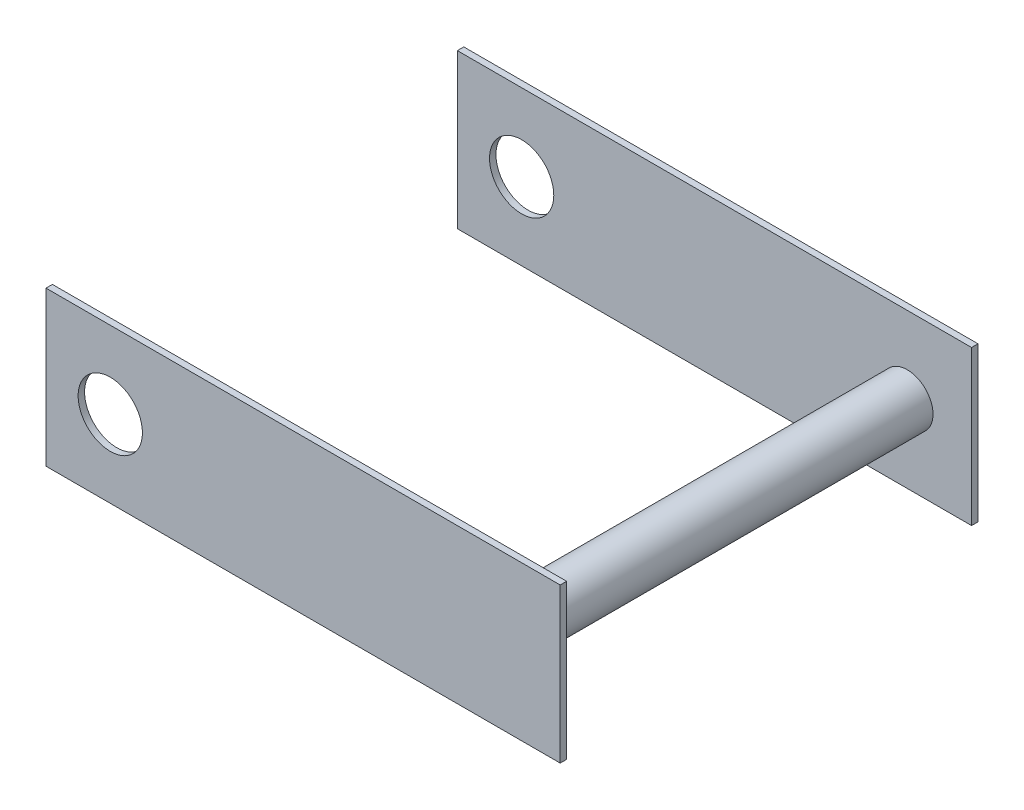
ISO-10303-21;
HEADER;
FILE_DESCRIPTION(('STEP AP214'),'2;1');
FILE_NAME('part.step','',(''),(''),'','','');
FILE_SCHEMA(('AUTOMOTIVE_DESIGN { 1 0 10303 214 1 1 1 1 }'));
ENDSEC;
DATA;
#1=APPLICATION_CONTEXT('core data for automotive mechanical design processes');
#2=APPLICATION_PROTOCOL_DEFINITION('international standard','automotive_design',2000,#1);
#3=PRODUCT_CONTEXT('',#1,'mechanical');
#4=PRODUCT('Part','Part','',(#3));
#5=PRODUCT_RELATED_PRODUCT_CATEGORY('part','',(#4));
#6=PRODUCT_DEFINITION_FORMATION('','',#4);
#7=PRODUCT_DEFINITION_CONTEXT('part definition',#1,'design');
#8=PRODUCT_DEFINITION('design','',#6,#7);
#9=PRODUCT_DEFINITION_SHAPE('','',#8);
#10=(LENGTH_UNIT() NAMED_UNIT(*) SI_UNIT(.MILLI.,.METRE.));
#11=(NAMED_UNIT(*) PLANE_ANGLE_UNIT() SI_UNIT($,.RADIAN.));
#12=(NAMED_UNIT(*) SI_UNIT($,.STERADIAN.) SOLID_ANGLE_UNIT());
#13=UNCERTAINTY_MEASURE_WITH_UNIT(LENGTH_MEASURE(1.E-05),#10,'distance_accuracy_value','');
#14=(GEOMETRIC_REPRESENTATION_CONTEXT(3) GLOBAL_UNCERTAINTY_ASSIGNED_CONTEXT((#13)) GLOBAL_UNIT_ASSIGNED_CONTEXT((#10,
#11,#12)) REPRESENTATION_CONTEXT('',''));
#15=CARTESIAN_POINT('',(0.,0.,0.));
#16=DIRECTION('',(0.,0.,1.));
#17=DIRECTION('',(1.,0.,0.));
#18=AXIS2_PLACEMENT_3D('',#15,#16,#17);
#19=CARTESIAN_POINT('',(25.4,0.,76.2));
#20=DIRECTION('',(0.,0.,-1.));
#21=DIRECTION('',(-1.,0.,0.));
#22=AXIS2_PLACEMENT_3D('',#19,#20,#21);
#23=CYLINDRICAL_SURFACE('',#22,10.16);
#24=CARTESIAN_POINT('',(25.4,0.,-86.3600000000002));
#25=DIRECTION('',(0.,0.,1.));
#26=DIRECTION('',(1.,0.,0.));
#27=AXIS2_PLACEMENT_3D('',#24,#25,#26);
#28=CIRCLE('',#27,10.16);
#29=CARTESIAN_POINT('',(35.56,0.,-86.3600000000002));
#30=VERTEX_POINT('',#29);
#31=EDGE_CURVE('E40',#30,#30,#28,.T.);
#32=ORIENTED_EDGE('',*,*,#31,.T.);
#33=EDGE_LOOP('',(#32));
#34=FACE_BOUND('',#33,.T.);
#35=CARTESIAN_POINT('',(25.4,0.,73.66));
#36=DIRECTION('',(0.,0.,1.));
#37=DIRECTION('',(1.,0.,0.));
#38=AXIS2_PLACEMENT_3D('',#35,#36,#37);
#39=CIRCLE('',#38,10.16);
#40=CARTESIAN_POINT('',(35.56,0.,73.66));
#41=VERTEX_POINT('',#40);
#42=EDGE_CURVE('E11',#41,#41,#39,.T.);
#43=ORIENTED_EDGE('',*,*,#42,.F.);
#44=EDGE_LOOP('',(#43));
#45=FACE_BOUND('',#44,.T.);
#46=ADVANCED_FACE('F32',(#34,#45),#23,.T.);
#47=CARTESIAN_POINT('',(0.,0.,-86.3600000000002));
#48=DIRECTION('',(0.,0.,1.));
#49=DIRECTION('',(1.,0.,0.));
#50=AXIS2_PLACEMENT_3D('',#47,#48,#49);
#51=PLANE('',#50);
#52=CARTESIAN_POINT('',(-127.,0.,-86.3600000000002));
#53=DIRECTION('',(0.,0.,1.));
#54=DIRECTION('',(1.,0.,0.));
#55=AXIS2_PLACEMENT_3D('',#52,#53,#54);
#56=CIRCLE('',#55,12.7);
#57=CARTESIAN_POINT('',(-114.3,0.,-86.3600000000002));
#58=VERTEX_POINT('',#57);
#59=EDGE_CURVE('E138',#58,#58,#56,.T.);
#60=ORIENTED_EDGE('',*,*,#59,.F.);
#61=EDGE_LOOP('',(#60));
#62=FACE_BOUND('',#61,.T.);
#63=DIRECTION('',(0.,-1.,0.));
#64=VECTOR('',#63,1.);
#65=CARTESIAN_POINT('',(50.8,-30.48,-86.3600000000002));
#66=LINE('',#65,#64);
#67=CARTESIAN_POINT('',(50.8,30.48,-86.3600000000002));
#68=VERTEX_POINT('',#67);
#69=CARTESIAN_POINT('',(50.8,-30.48,-86.3600000000002));
#70=VERTEX_POINT('',#69);
#71=EDGE_CURVE('E153',#68,#70,#66,.T.);
#72=ORIENTED_EDGE('',*,*,#71,.F.);
#73=DIRECTION('',(1.,0.,0.));
#74=VECTOR('',#73,1.);
#75=CARTESIAN_POINT('',(50.8,30.48,-86.3600000000002));
#76=LINE('',#75,#74);
#77=CARTESIAN_POINT('',(-152.4,30.48,-86.3600000000002));
#78=VERTEX_POINT('',#77);
#79=EDGE_CURVE('E160',#78,#68,#76,.T.);
#80=ORIENTED_EDGE('',*,*,#79,.F.);
#81=DIRECTION('',(0.,1.,0.));
#82=VECTOR('',#81,1.);
#83=CARTESIAN_POINT('',(-152.4,-30.48,-86.3600000000002));
#84=LINE('',#83,#82);
#85=CARTESIAN_POINT('',(-152.4,-30.48,-86.3600000000002));
#86=VERTEX_POINT('',#85);
#87=EDGE_CURVE('E158',#86,#78,#84,.T.);
#88=ORIENTED_EDGE('',*,*,#87,.F.);
#89=DIRECTION('',(-1.,0.,0.));
#90=VECTOR('',#89,1.);
#91=CARTESIAN_POINT('',(50.8,-30.48,-86.3600000000002));
#92=LINE('',#91,#90);
#93=EDGE_CURVE('E155',#70,#86,#92,.T.);
#94=ORIENTED_EDGE('',*,*,#93,.F.);
#95=EDGE_LOOP('',(#72,#80,#88,#94));
#96=FACE_BOUND('',#95,.T.);
#97=ORIENTED_EDGE('',*,*,#31,.F.);
#98=EDGE_LOOP('',(#97));
#99=FACE_BOUND('',#98,.T.);
#100=ADVANCED_FACE('F180',(#62,#96,#99),#51,.T.);
#101=CARTESIAN_POINT('',(50.8,-30.48,-86.3600000000002));
#102=DIRECTION('',(1.,0.,0.));
#103=DIRECTION('',(0.,0.,-1.));
#104=AXIS2_PLACEMENT_3D('',#101,#102,#103);
#105=PLANE('',#104);
#106=DIRECTION('',(0.,-1.,0.));
#107=VECTOR('',#106,1.);
#108=CARTESIAN_POINT('',(50.8,-30.48,-88.9000000000002));
#109=LINE('',#108,#107);
#110=CARTESIAN_POINT('',(50.8,30.48,-88.9000000000002));
#111=VERTEX_POINT('',#110);
#112=CARTESIAN_POINT('',(50.8,-30.48,-88.9000000000002));
#113=VERTEX_POINT('',#112);
#114=EDGE_CURVE('E149',#111,#113,#109,.T.);
#115=ORIENTED_EDGE('',*,*,#114,.F.);
#116=DIRECTION('',(0.,0.,-1.));
#117=VECTOR('',#116,1.);
#118=CARTESIAN_POINT('',(50.8,30.48,-86.3600000000002));
#119=LINE('',#118,#117);
#120=EDGE_CURVE('E48',#68,#111,#119,.T.);
#121=ORIENTED_EDGE('',*,*,#120,.F.);
#122=ORIENTED_EDGE('',*,*,#71,.T.);
#123=DIRECTION('',(0.,0.,-1.));
#124=VECTOR('',#123,1.);
#125=CARTESIAN_POINT('',(50.8,-30.48,-86.3600000000002));
#126=LINE('',#125,#124);
#127=EDGE_CURVE('E77',#70,#113,#126,.T.);
#128=ORIENTED_EDGE('',*,*,#127,.T.);
#129=EDGE_LOOP('',(#115,#121,#122,#128));
#130=FACE_BOUND('',#129,.T.);
#131=ADVANCED_FACE('F182',(#130),#105,.T.);
#132=CARTESIAN_POINT('',(50.8,30.48,-86.3600000000002));
#133=DIRECTION('',(0.,1.,0.));
#134=DIRECTION('',(0.,0.,1.));
#135=AXIS2_PLACEMENT_3D('',#132,#133,#134);
#136=PLANE('',#135);
#137=DIRECTION('',(1.,0.,0.));
#138=VECTOR('',#137,1.);
#139=CARTESIAN_POINT('',(50.8,30.48,-88.9000000000002));
#140=LINE('',#139,#138);
#141=CARTESIAN_POINT('',(-152.4,30.48,-88.9000000000002));
#142=VERTEX_POINT('',#141);
#143=EDGE_CURVE('E156',#142,#111,#140,.T.);
#144=ORIENTED_EDGE('',*,*,#143,.F.);
#145=DIRECTION('',(0.,0.,-1.));
#146=VECTOR('',#145,1.);
#147=CARTESIAN_POINT('',(-152.4,30.48,-86.3600000000002));
#148=LINE('',#147,#146);
#149=EDGE_CURVE('E66',#78,#142,#148,.T.);
#150=ORIENTED_EDGE('',*,*,#149,.F.);
#151=ORIENTED_EDGE('',*,*,#79,.T.);
#152=ORIENTED_EDGE('',*,*,#120,.T.);
#153=EDGE_LOOP('',(#144,#150,#151,#152));
#154=FACE_BOUND('',#153,.T.);
#155=ADVANCED_FACE('F189',(#154),#136,.T.);
#156=CARTESIAN_POINT('',(-152.4,-30.48,-86.3600000000002));
#157=DIRECTION('',(-1.,0.,0.));
#158=DIRECTION('',(0.,0.,1.));
#159=AXIS2_PLACEMENT_3D('',#156,#157,#158);
#160=PLANE('',#159);
#161=DIRECTION('',(0.,1.,0.));
#162=VECTOR('',#161,1.);
#163=CARTESIAN_POINT('',(-152.4,-30.48,-88.9000000000002));
#164=LINE('',#163,#162);
#165=CARTESIAN_POINT('',(-152.4,-30.48,-88.9000000000002));
#166=VERTEX_POINT('',#165);
#167=EDGE_CURVE('E167',#166,#142,#164,.T.);
#168=ORIENTED_EDGE('',*,*,#167,.F.);
#169=DIRECTION('',(0.,0.,-1.));
#170=VECTOR('',#169,1.);
#171=CARTESIAN_POINT('',(-152.4,-30.48,-86.3600000000002));
#172=LINE('',#171,#170);
#173=EDGE_CURVE('E173',#86,#166,#172,.T.);
#174=ORIENTED_EDGE('',*,*,#173,.F.);
#175=ORIENTED_EDGE('',*,*,#87,.T.);
#176=ORIENTED_EDGE('',*,*,#149,.T.);
#177=EDGE_LOOP('',(#168,#174,#175,#176));
#178=FACE_BOUND('',#177,.T.);
#179=ADVANCED_FACE('F198',(#178),#160,.T.);
#180=CARTESIAN_POINT('',(50.8,-30.48,-86.3600000000002));
#181=DIRECTION('',(0.,-1.,0.));
#182=DIRECTION('',(0.,0.,-1.));
#183=AXIS2_PLACEMENT_3D('',#180,#181,#182);
#184=PLANE('',#183);
#185=DIRECTION('',(-1.,0.,0.));
#186=VECTOR('',#185,1.);
#187=CARTESIAN_POINT('',(50.8,-30.48,-88.9000000000002));
#188=LINE('',#187,#186);
#189=EDGE_CURVE('E164',#113,#166,#188,.T.);
#190=ORIENTED_EDGE('',*,*,#189,.F.);
#191=ORIENTED_EDGE('',*,*,#127,.F.);
#192=ORIENTED_EDGE('',*,*,#93,.T.);
#193=ORIENTED_EDGE('',*,*,#173,.T.);
#194=EDGE_LOOP('',(#190,#191,#192,#193));
#195=FACE_BOUND('',#194,.T.);
#196=ADVANCED_FACE('F201',(#195),#184,.T.);
#197=CARTESIAN_POINT('',(25.4,0.,-88.9000000000002));
#198=DIRECTION('',(0.,0.,1.));
#199=DIRECTION('',(1.,0.,0.));
#200=AXIS2_PLACEMENT_3D('',#197,#198,#199);
#201=PLANE('',#200);
#202=CARTESIAN_POINT('',(-127.,0.,-88.9000000000002));
#203=DIRECTION('',(0.,0.,1.));
#204=DIRECTION('',(1.,0.,0.));
#205=AXIS2_PLACEMENT_3D('',#202,#203,#204);
#206=CIRCLE('',#205,12.7);
#207=CARTESIAN_POINT('',(-114.3,0.,-88.9000000000002));
#208=VERTEX_POINT('',#207);
#209=EDGE_CURVE('E245',#208,#208,#206,.T.);
#210=ORIENTED_EDGE('',*,*,#209,.T.);
#211=EDGE_LOOP('',(#210));
#212=FACE_BOUND('',#211,.T.);
#213=ORIENTED_EDGE('',*,*,#114,.T.);
#214=ORIENTED_EDGE('',*,*,#189,.T.);
#215=ORIENTED_EDGE('',*,*,#167,.T.);
#216=ORIENTED_EDGE('',*,*,#143,.T.);
#217=EDGE_LOOP('',(#213,#214,#215,#216));
#218=FACE_BOUND('',#217,.T.);
#219=ADVANCED_FACE('F203',(#212,#218),#201,.F.);
#220=CARTESIAN_POINT('',(0.,0.,73.66));
#221=DIRECTION('',(0.,0.,1.));
#222=DIRECTION('',(1.,0.,0.));
#223=AXIS2_PLACEMENT_3D('',#220,#221,#222);
#224=PLANE('',#223);
#225=CARTESIAN_POINT('',(-127.,0.,73.66));
#226=DIRECTION('',(0.,0.,1.));
#227=DIRECTION('',(1.,0.,0.));
#228=AXIS2_PLACEMENT_3D('',#225,#226,#227);
#229=CIRCLE('',#228,12.7);
#230=CARTESIAN_POINT('',(-114.3,0.,73.66));
#231=VERTEX_POINT('',#230);
#232=EDGE_CURVE('E246',#231,#231,#229,.T.);
#233=ORIENTED_EDGE('',*,*,#232,.T.);
#234=EDGE_LOOP('',(#233));
#235=FACE_BOUND('',#234,.T.);
#236=DIRECTION('',(1.,0.,0.));
#237=VECTOR('',#236,1.);
#238=CARTESIAN_POINT('',(-152.4,-30.48,73.66));
#239=LINE('',#238,#237);
#240=CARTESIAN_POINT('',(-152.4,-30.48,73.66));
#241=VERTEX_POINT('',#240);
#242=CARTESIAN_POINT('',(50.8,-30.48,73.66));
#243=VERTEX_POINT('',#242);
#244=EDGE_CURVE('E125',#241,#243,#239,.T.);
#245=ORIENTED_EDGE('',*,*,#244,.F.);
#246=DIRECTION('',(0.,-1.,0.));
#247=VECTOR('',#246,1.);
#248=CARTESIAN_POINT('',(-152.4,30.48,73.66));
#249=LINE('',#248,#247);
#250=CARTESIAN_POINT('',(-152.4,30.48,73.66));
#251=VERTEX_POINT('',#250);
#252=EDGE_CURVE('E117',#251,#241,#249,.T.);
#253=ORIENTED_EDGE('',*,*,#252,.F.);
#254=DIRECTION('',(-1.,0.,0.));
#255=VECTOR('',#254,1.);
#256=CARTESIAN_POINT('',(50.8,30.48,73.66));
#257=LINE('',#256,#255);
#258=CARTESIAN_POINT('',(50.8,30.48,73.66));
#259=VERTEX_POINT('',#258);
#260=EDGE_CURVE('E128',#259,#251,#257,.T.);
#261=ORIENTED_EDGE('',*,*,#260,.F.);
#262=DIRECTION('',(0.,1.,0.));
#263=VECTOR('',#262,1.);
#264=CARTESIAN_POINT('',(50.8,-30.48,73.66));
#265=LINE('',#264,#263);
#266=EDGE_CURVE('E109',#243,#259,#265,.T.);
#267=ORIENTED_EDGE('',*,*,#266,.F.);
#268=EDGE_LOOP('',(#245,#253,#261,#267));
#269=FACE_BOUND('',#268,.T.);
#270=ORIENTED_EDGE('',*,*,#42,.T.);
#271=EDGE_LOOP('',(#270));
#272=FACE_BOUND('',#271,.T.);
#273=ADVANCED_FACE('F122',(#235,#269,#272),#224,.F.);
#274=CARTESIAN_POINT('',(-152.4,-30.48,73.66));
#275=DIRECTION('',(0.,-1.,0.));
#276=DIRECTION('',(0.,0.,-1.));
#277=AXIS2_PLACEMENT_3D('',#274,#275,#276);
#278=PLANE('',#277);
#279=DIRECTION('',(1.,0.,0.));
#280=VECTOR('',#279,1.);
#281=CARTESIAN_POINT('',(-152.4,-30.48,76.2));
#282=LINE('',#281,#280);
#283=CARTESIAN_POINT('',(-152.4,-30.48,76.2));
#284=VERTEX_POINT('',#283);
#285=CARTESIAN_POINT('',(50.8,-30.48,76.2));
#286=VERTEX_POINT('',#285);
#287=EDGE_CURVE('E143',#284,#286,#282,.T.);
#288=ORIENTED_EDGE('',*,*,#287,.F.);
#289=DIRECTION('',(0.,0.,1.));
#290=VECTOR('',#289,1.);
#291=CARTESIAN_POINT('',(-152.4,-30.48,73.66));
#292=LINE('',#291,#290);
#293=EDGE_CURVE('E131',#241,#284,#292,.T.);
#294=ORIENTED_EDGE('',*,*,#293,.F.);
#295=ORIENTED_EDGE('',*,*,#244,.T.);
#296=DIRECTION('',(0.,0.,1.));
#297=VECTOR('',#296,1.);
#298=CARTESIAN_POINT('',(50.8,-30.48,73.66));
#299=LINE('',#298,#297);
#300=EDGE_CURVE('E106',#243,#286,#299,.T.);
#301=ORIENTED_EDGE('',*,*,#300,.T.);
#302=EDGE_LOOP('',(#288,#294,#295,#301));
#303=FACE_BOUND('',#302,.T.);
#304=ADVANCED_FACE('F130',(#303),#278,.T.);
#305=CARTESIAN_POINT('',(-152.4,30.48,73.66));
#306=DIRECTION('',(-1.,0.,0.));
#307=DIRECTION('',(0.,0.,1.));
#308=AXIS2_PLACEMENT_3D('',#305,#306,#307);
#309=PLANE('',#308);
#310=DIRECTION('',(0.,-1.,0.));
#311=VECTOR('',#310,1.);
#312=CARTESIAN_POINT('',(-152.4,30.48,76.2));
#313=LINE('',#312,#311);
#314=CARTESIAN_POINT('',(-152.4,30.48,76.2));
#315=VERTEX_POINT('',#314);
#316=EDGE_CURVE('E132',#315,#284,#313,.T.);
#317=ORIENTED_EDGE('',*,*,#316,.F.);
#318=DIRECTION('',(0.,0.,1.));
#319=VECTOR('',#318,1.);
#320=CARTESIAN_POINT('',(-152.4,30.48,73.66));
#321=LINE('',#320,#319);
#322=EDGE_CURVE('E150',#251,#315,#321,.T.);
#323=ORIENTED_EDGE('',*,*,#322,.F.);
#324=ORIENTED_EDGE('',*,*,#252,.T.);
#325=ORIENTED_EDGE('',*,*,#293,.T.);
#326=EDGE_LOOP('',(#317,#323,#324,#325));
#327=FACE_BOUND('',#326,.T.);
#328=ADVANCED_FACE('F226',(#327),#309,.T.);
#329=CARTESIAN_POINT('',(50.8,30.48,73.66));
#330=DIRECTION('',(0.,1.,0.));
#331=DIRECTION('',(0.,0.,1.));
#332=AXIS2_PLACEMENT_3D('',#329,#330,#331);
#333=PLANE('',#332);
#334=DIRECTION('',(-1.,0.,0.));
#335=VECTOR('',#334,1.);
#336=CARTESIAN_POINT('',(50.8,30.48,76.2));
#337=LINE('',#336,#335);
#338=CARTESIAN_POINT('',(50.8,30.48,76.2));
#339=VERTEX_POINT('',#338);
#340=EDGE_CURVE('E135',#339,#315,#337,.T.);
#341=ORIENTED_EDGE('',*,*,#340,.F.);
#342=DIRECTION('',(0.,0.,1.));
#343=VECTOR('',#342,1.);
#344=CARTESIAN_POINT('',(50.8,30.48,73.66));
#345=LINE('',#344,#343);
#346=EDGE_CURVE('E116',#259,#339,#345,.T.);
#347=ORIENTED_EDGE('',*,*,#346,.F.);
#348=ORIENTED_EDGE('',*,*,#260,.T.);
#349=ORIENTED_EDGE('',*,*,#322,.T.);
#350=EDGE_LOOP('',(#341,#347,#348,#349));
#351=FACE_BOUND('',#350,.T.);
#352=ADVANCED_FACE('F218',(#351),#333,.T.);
#353=CARTESIAN_POINT('',(50.8,-30.48,73.66));
#354=DIRECTION('',(1.,0.,0.));
#355=DIRECTION('',(0.,0.,-1.));
#356=AXIS2_PLACEMENT_3D('',#353,#354,#355);
#357=PLANE('',#356);
#358=DIRECTION('',(0.,1.,0.));
#359=VECTOR('',#358,1.);
#360=CARTESIAN_POINT('',(50.8,-30.48,76.2));
#361=LINE('',#360,#359);
#362=EDGE_CURVE('E111',#286,#339,#361,.T.);
#363=ORIENTED_EDGE('',*,*,#362,.F.);
#364=ORIENTED_EDGE('',*,*,#300,.F.);
#365=ORIENTED_EDGE('',*,*,#266,.T.);
#366=ORIENTED_EDGE('',*,*,#346,.T.);
#367=EDGE_LOOP('',(#363,#364,#365,#366));
#368=FACE_BOUND('',#367,.T.);
#369=ADVANCED_FACE('F108',(#368),#357,.T.);
#370=CARTESIAN_POINT('',(25.4,0.,76.2));
#371=DIRECTION('',(0.,0.,1.));
#372=DIRECTION('',(1.,0.,0.));
#373=AXIS2_PLACEMENT_3D('',#370,#371,#372);
#374=PLANE('',#373);
#375=CARTESIAN_POINT('',(-127.,0.,76.2));
#376=DIRECTION('',(0.,0.,1.));
#377=DIRECTION('',(1.,0.,0.));
#378=AXIS2_PLACEMENT_3D('',#375,#376,#377);
#379=CIRCLE('',#378,12.7);
#380=CARTESIAN_POINT('',(-114.3,0.,76.2));
#381=VERTEX_POINT('',#380);
#382=EDGE_CURVE('E222',#381,#381,#379,.T.);
#383=ORIENTED_EDGE('',*,*,#382,.F.);
#384=EDGE_LOOP('',(#383));
#385=FACE_BOUND('',#384,.T.);
#386=ORIENTED_EDGE('',*,*,#287,.T.);
#387=ORIENTED_EDGE('',*,*,#362,.T.);
#388=ORIENTED_EDGE('',*,*,#340,.T.);
#389=ORIENTED_EDGE('',*,*,#316,.T.);
#390=EDGE_LOOP('',(#386,#387,#388,#389));
#391=FACE_BOUND('',#390,.T.);
#392=ADVANCED_FACE('F207',(#385,#391),#374,.T.);
#393=CARTESIAN_POINT('',(-127.,0.,-88.9000000000002));
#394=DIRECTION('',(0.,0.,1.));
#395=DIRECTION('',(1.,0.,0.));
#396=AXIS2_PLACEMENT_3D('',#393,#394,#395);
#397=CYLINDRICAL_SURFACE('',#396,12.7);
#398=ORIENTED_EDGE('',*,*,#382,.T.);
#399=EDGE_LOOP('',(#398));
#400=FACE_BOUND('',#399,.T.);
#401=ORIENTED_EDGE('',*,*,#232,.F.);
#402=EDGE_LOOP('',(#401));
#403=FACE_BOUND('',#402,.T.);
#404=ADVANCED_FACE('F209',(#400,#403),#397,.F.);
#405=ORIENTED_EDGE('',*,*,#59,.T.);
#406=EDGE_LOOP('',(#405));
#407=FACE_BOUND('',#406,.T.);
#408=ORIENTED_EDGE('',*,*,#209,.F.);
#409=EDGE_LOOP('',(#408));
#410=FACE_BOUND('',#409,.T.);
#411=ADVANCED_FACE('F215',(#407,#410),#397,.F.);
#412=CLOSED_SHELL('',(#46,#100,#131,#155,#179,#196,#219,#273,#304,#328,#352,#369,#392,#404,#411));
#413=MANIFOLD_SOLID_BREP('B2',#412);
#414=ADVANCED_BREP_SHAPE_REPRESENTATION('',(#18,#413),#14);
#415=SHAPE_DEFINITION_REPRESENTATION(#9,#414);
ENDSEC;
END-ISO-10303-21;
